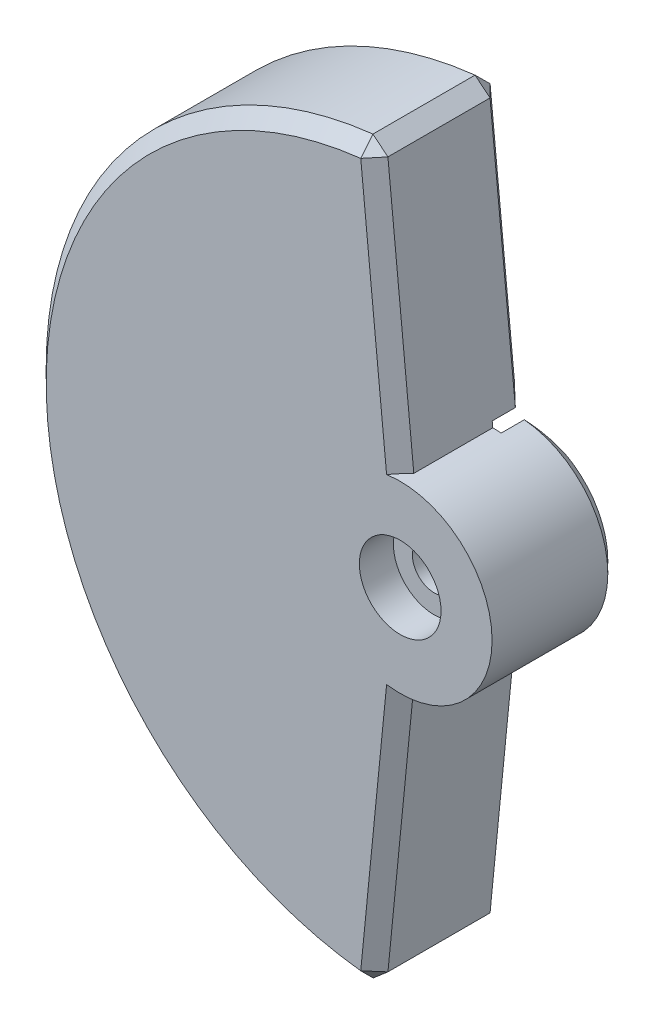
ISO-10303-21;
HEADER;
FILE_DESCRIPTION(('STEP AP214'),'2;1');
FILE_NAME('part.step','',(''),(''),'','','');
FILE_SCHEMA(('AUTOMOTIVE_DESIGN { 1 0 10303 214 1 1 1 1 }'));
ENDSEC;
DATA;
#1=APPLICATION_CONTEXT('core data for automotive mechanical design processes');
#2=APPLICATION_PROTOCOL_DEFINITION('international standard','automotive_design',2000,#1);
#3=PRODUCT_CONTEXT('',#1,'mechanical');
#4=PRODUCT('Part','Part','',(#3));
#5=PRODUCT_RELATED_PRODUCT_CATEGORY('part','',(#4));
#6=PRODUCT_DEFINITION_FORMATION('','',#4);
#7=PRODUCT_DEFINITION_CONTEXT('part definition',#1,'design');
#8=PRODUCT_DEFINITION('design','',#6,#7);
#9=PRODUCT_DEFINITION_SHAPE('','',#8);
#10=(LENGTH_UNIT() NAMED_UNIT(*) SI_UNIT(.MILLI.,.METRE.));
#11=(NAMED_UNIT(*) PLANE_ANGLE_UNIT() SI_UNIT($,.RADIAN.));
#12=(NAMED_UNIT(*) SI_UNIT($,.STERADIAN.) SOLID_ANGLE_UNIT());
#13=UNCERTAINTY_MEASURE_WITH_UNIT(LENGTH_MEASURE(1.E-05),#10,'distance_accuracy_value','');
#14=(GEOMETRIC_REPRESENTATION_CONTEXT(3) GLOBAL_UNCERTAINTY_ASSIGNED_CONTEXT((#13)) GLOBAL_UNIT_ASSIGNED_CONTEXT((#10,
#11,#12)) REPRESENTATION_CONTEXT('',''));
#15=CARTESIAN_POINT('',(0.,0.,0.));
#16=DIRECTION('',(0.,0.,1.));
#17=DIRECTION('',(1.,0.,0.));
#18=AXIS2_PLACEMENT_3D('',#15,#16,#17);
#19=CARTESIAN_POINT('',(0.,0.,10.));
#20=DIRECTION('',(0.,0.,-1.));
#21=DIRECTION('',(-1.,0.,0.));
#22=AXIS2_PLACEMENT_3D('',#19,#20,#21);
#23=CYLINDRICAL_SURFACE('',#22,1.6);
#24=CARTESIAN_POINT('',(0.,0.,2.7));
#25=DIRECTION('',(0.,0.,1.));
#26=DIRECTION('',(1.,0.,0.));
#27=AXIS2_PLACEMENT_3D('',#24,#25,#26);
#28=CIRCLE('',#27,1.6);
#29=CARTESIAN_POINT('',(1.6,0.,2.7));
#30=VERTEX_POINT('',#29);
#31=EDGE_CURVE('E361',#30,#30,#28,.F.);
#32=ORIENTED_EDGE('',*,*,#31,.T.);
#33=EDGE_LOOP('',(#32));
#34=FACE_BOUND('',#33,.T.);
#35=CARTESIAN_POINT('',(0.,0.,7.));
#36=DIRECTION('',(0.,0.,1.));
#37=DIRECTION('',(1.,0.,0.));
#38=AXIS2_PLACEMENT_3D('',#35,#36,#37);
#39=CIRCLE('',#38,1.6);
#40=CARTESIAN_POINT('',(1.6,0.,7.));
#41=VERTEX_POINT('',#40);
#42=EDGE_CURVE('E45',#41,#41,#39,.F.);
#43=ORIENTED_EDGE('',*,*,#42,.F.);
#44=EDGE_LOOP('',(#43));
#45=FACE_BOUND('',#44,.T.);
#46=ADVANCED_FACE('F40',(#34,#45),#23,.F.);
#47=CARTESIAN_POINT('',(0.,0.,0.));
#48=DIRECTION('',(0.,0.,1.));
#49=DIRECTION('',(1.,0.,0.));
#50=AXIS2_PLACEMENT_3D('',#47,#48,#49);
#51=PLANE('',#50);
#52=DIRECTION('',(0.828685457868795,0.559714580761289,0.));
#53=VECTOR('',#52,1.);
#54=CARTESIAN_POINT('',(-10.2278949940436,-14.0459951002762,0.));
#55=LINE('',#54,#53);
#56=CARTESIAN_POINT('',(-10.2278949940436,-14.0459951002762,0.));
#57=VERTEX_POINT('',#56);
#58=CARTESIAN_POINT('',(-1.11821428972066,-7.8930922492929,0.));
#59=VERTEX_POINT('',#58);
#60=EDGE_CURVE('E221',#57,#59,#55,.T.);
#61=ORIENTED_EDGE('',*,*,#60,.T.);
#62=DIRECTION('',(-0.0986450595758293,-0.995122681995181,0.));
#63=VECTOR('',#62,1.);
#64=CARTESIAN_POINT('',(-0.332516112303122,0.0329618370694754,0.));
#65=LINE('',#64,#63);
#66=CARTESIAN_POINT('',(-2.89707584366268,-25.8380910973715,0.));
#67=VERTEX_POINT('',#66);
#68=EDGE_CURVE('E66',#59,#67,#65,.T.);
#69=ORIENTED_EDGE('',*,*,#68,.T.);
#70=CARTESIAN_POINT('',(0.,0.,0.));
#71=DIRECTION('',(0.,0.,1.));
#72=DIRECTION('',(1.,0.,0.));
#73=AXIS2_PLACEMENT_3D('',#70,#71,#72);
#74=CIRCLE('',#73,26.);
#75=CARTESIAN_POINT('',(-2.89707584366267,25.8380910973715,0.));
#76=VERTEX_POINT('',#75);
#77=EDGE_CURVE('E350',#67,#76,#74,.F.);
#78=ORIENTED_EDGE('',*,*,#77,.T.);
#79=DIRECTION('',(0.0986450595758293,-0.995122681995181,0.));
#80=VECTOR('',#79,1.);
#81=CARTESIAN_POINT('',(-0.332516112303121,-0.0329618370694754,0.));
#82=LINE('',#81,#80);
#83=CARTESIAN_POINT('',(-1.11821428972066,7.8930922492929,0.));
#84=VERTEX_POINT('',#83);
#85=EDGE_CURVE('E527',#76,#84,#82,.T.);
#86=ORIENTED_EDGE('',*,*,#85,.T.);
#87=DIRECTION('',(0.828685457868795,-0.559714580761289,0.));
#88=VECTOR('',#87,1.);
#89=CARTESIAN_POINT('',(-10.2278949940436,14.0459951002762,0.));
#90=LINE('',#89,#88);
#91=CARTESIAN_POINT('',(-10.2278949940436,14.0459951002762,0.));
#92=VERTEX_POINT('',#91);
#93=EDGE_CURVE('E253',#92,#84,#90,.T.);
#94=ORIENTED_EDGE('',*,*,#93,.F.);
#95=CARTESIAN_POINT('',(-11.7671100911372,11.767110091137,0.));
#96=DIRECTION('',(0.,0.,1.));
#97=DIRECTION('',(1.,0.,0.));
#98=AXIS2_PLACEMENT_3D('',#95,#96,#97);
#99=CIRCLE('',#98,2.75);
#100=CARTESIAN_POINT('',(-13.9318767752108,10.071148651857,0.));
#101=VERTEX_POINT('',#100);
#102=EDGE_CURVE('E249',#92,#101,#99,.T.);
#103=ORIENTED_EDGE('',*,*,#102,.T.);
#104=DIRECTION('',(0.616713250647291,-0.787187885117684,0.));
#105=VECTOR('',#104,1.);
#106=CARTESIAN_POINT('',(-13.9318767752108,10.071148651857,0.));
#107=LINE('',#106,#105);
#108=CARTESIAN_POINT('',(-6.04175176152328,0.,0.));
#109=VERTEX_POINT('',#108);
#110=EDGE_CURVE('E246',#101,#109,#107,.T.);
#111=ORIENTED_EDGE('',*,*,#110,.T.);
#112=DIRECTION('',(0.616713250647291,0.787187885117684,0.));
#113=VECTOR('',#112,1.);
#114=CARTESIAN_POINT('',(-13.9318767752108,-10.071148651857,0.));
#115=LINE('',#114,#113);
#116=CARTESIAN_POINT('',(-13.9318767752108,-10.071148651857,0.));
#117=VERTEX_POINT('',#116);
#118=EDGE_CURVE('E207',#117,#109,#115,.T.);
#119=ORIENTED_EDGE('',*,*,#118,.F.);
#120=CARTESIAN_POINT('',(-11.7671100911372,-11.767110091137,0.));
#121=DIRECTION('',(0.,0.,-1.));
#122=DIRECTION('',(-1.,0.,0.));
#123=AXIS2_PLACEMENT_3D('',#120,#121,#122);
#124=CIRCLE('',#123,2.75);
#125=EDGE_CURVE('E217',#57,#117,#124,.T.);
#126=ORIENTED_EDGE('',*,*,#125,.F.);
#127=EDGE_LOOP('',(#61,#69,#78,#86,#94,#103,#111,#119,#126));
#128=FACE_BOUND('',#127,.T.);
#129=ADVANCED_FACE('F443',(#128),#51,.F.);
#130=CARTESIAN_POINT('',(0.,0.,-63.6793726413821));
#131=DIRECTION('',(0.,0.,1.));
#132=DIRECTION('',(1.,0.,0.));
#133=AXIS2_PLACEMENT_3D('',#130,#131,#132);
#134=CYLINDRICAL_SURFACE('',#133,6.75);
#135=CARTESIAN_POINT('',(0.,0.,2.69999999999999));
#136=DIRECTION('',(0.,0.,1.));
#137=DIRECTION('',(1.,0.,0.));
#138=AXIS2_PLACEMENT_3D('',#135,#136,#137);
#139=CIRCLE('',#138,6.75);
#140=CARTESIAN_POINT('',(0.615876323061439,-6.72184471366992,2.69999999999999));
#141=VERTEX_POINT('',#140);
#142=CARTESIAN_POINT('',(0.,-6.75,2.7));
#143=VERTEX_POINT('',#142);
#144=EDGE_CURVE('E577',#141,#143,#139,.F.);
#145=ORIENTED_EDGE('',*,*,#144,.F.);
#146=DIRECTION('',(0.,0.,1.));
#147=VECTOR('',#146,1.);
#148=CARTESIAN_POINT('',(0.615876323061434,-6.72184471366993,-63.6793726413821));
#149=LINE('',#148,#147);
#150=CARTESIAN_POINT('',(0.615876323061438,-6.72184471366993,0.999999999999987));
#151=VERTEX_POINT('',#150);
#152=EDGE_CURVE('E289',#141,#151,#149,.F.);
#153=ORIENTED_EDGE('',*,*,#152,.T.);
#154=CARTESIAN_POINT('',(0.,0.,0.999999999999987));
#155=DIRECTION('',(0.,0.,1.));
#156=DIRECTION('',(1.,0.,0.));
#157=AXIS2_PLACEMENT_3D('',#154,#155,#156);
#158=CIRCLE('',#157,6.75);
#159=CARTESIAN_POINT('',(0.615876323061438,6.72184471366993,0.999999999999987));
#160=VERTEX_POINT('',#159);
#161=EDGE_CURVE('E339',#151,#160,#158,.T.);
#162=ORIENTED_EDGE('',*,*,#161,.T.);
#163=DIRECTION('',(0.,0.,1.));
#164=VECTOR('',#163,1.);
#165=CARTESIAN_POINT('',(0.615876323061434,6.72184471366993,-63.6793726413821));
#166=LINE('',#165,#164);
#167=CARTESIAN_POINT('',(0.615876323061439,6.72184471366992,2.69999999999999));
#168=VERTEX_POINT('',#167);
#169=EDGE_CURVE('E585',#168,#160,#166,.F.);
#170=ORIENTED_EDGE('',*,*,#169,.F.);
#171=CARTESIAN_POINT('',(0.,6.75,2.7));
#172=VERTEX_POINT('',#171);
#173=EDGE_CURVE('E572',#172,#168,#139,.F.);
#174=ORIENTED_EDGE('',*,*,#173,.F.);
#175=DIRECTION('',(0.,0.,1.));
#176=VECTOR('',#175,1.);
#177=CARTESIAN_POINT('',(0.,6.75,-0.5));
#178=LINE('',#177,#176);
#179=CARTESIAN_POINT('',(0.,6.75,8.50000000000002));
#180=VERTEX_POINT('',#179);
#181=EDGE_CURVE('E563',#172,#180,#178,.T.);
#182=ORIENTED_EDGE('',*,*,#181,.T.);
#183=CARTESIAN_POINT('',(0.,0.,9.16585415213687));
#184=DIRECTION('',(0.703657996551333,0.0697525905566195,0.707106781186551));
#185=DIRECTION('',(-0.70365799655134,-0.0697525905566202,0.707106781186544));
#186=AXIS2_PLACEMENT_3D('',#183,#184,#185);
#187=ELLIPSE('',#186,9.54594154601835,6.75);
#188=CARTESIAN_POINT('',(-0.99755390763124,6.67588093073638,9.5));
#189=VERTEX_POINT('',#188);
#190=EDGE_CURVE('E348',#180,#189,#187,.T.);
#191=ORIENTED_EDGE('',*,*,#190,.T.);
#192=CARTESIAN_POINT('',(0.,0.,9.5));
#193=DIRECTION('',(0.,0.,1.));
#194=DIRECTION('',(1.,0.,0.));
#195=AXIS2_PLACEMENT_3D('',#192,#193,#194);
#196=CIRCLE('',#195,6.75);
#197=CARTESIAN_POINT('',(-0.99755390763124,-6.67588093073638,9.5));
#198=VERTEX_POINT('',#197);
#199=EDGE_CURVE('E560',#198,#189,#196,.T.);
#200=ORIENTED_EDGE('',*,*,#199,.F.);
#201=CARTESIAN_POINT('',(0.,0.,9.16585415213687));
#202=DIRECTION('',(0.703657996551333,-0.0697525905566195,0.707106781186551));
#203=DIRECTION('',(-0.70365799655134,0.0697525905566202,0.707106781186544));
#204=AXIS2_PLACEMENT_3D('',#201,#202,#203);
#205=ELLIPSE('',#204,9.54594154601835,6.75);
#206=CARTESIAN_POINT('',(0.,-6.75,8.50000000000002));
#207=VERTEX_POINT('',#206);
#208=EDGE_CURVE('E343',#198,#207,#205,.T.);
#209=ORIENTED_EDGE('',*,*,#208,.T.);
#210=DIRECTION('',(0.,0.,1.));
#211=VECTOR('',#210,1.);
#212=CARTESIAN_POINT('',(0.,-6.75,-0.5));
#213=LINE('',#212,#211);
#214=EDGE_CURVE('E564',#143,#207,#213,.T.);
#215=ORIENTED_EDGE('',*,*,#214,.F.);
#216=EDGE_LOOP('',(#145,#153,#162,#170,#174,#182,#191,#200,#209,#215));
#217=FACE_BOUND('',#216,.T.);
#218=ADVANCED_FACE('F450',(#217),#134,.T.);
#219=CARTESIAN_POINT('',(-2.,-26.9258240356725,10.));
#220=DIRECTION('',(-0.995122681995181,0.0986450595758292,0.));
#221=DIRECTION('',(-0.0986450595758292,-0.995122681995181,0.));
#222=AXIS2_PLACEMENT_3D('',#219,#220,#221);
#223=PLANE('',#222);
#224=DIRECTION('',(0.,0.,-1.));
#225=VECTOR('',#224,1.);
#226=CARTESIAN_POINT('',(-0.0412030045650611,-7.16565228492286,10.));
#227=LINE('',#226,#225);
#228=CARTESIAN_POINT('',(-0.0412030045650624,-7.16565228492286,2.7));
#229=VERTEX_POINT('',#228);
#230=CARTESIAN_POINT('',(-0.0412030045650615,-7.16565228492286,0.99999999999998));
#231=VERTEX_POINT('',#230);
#232=EDGE_CURVE('E58',#229,#231,#227,.T.);
#233=ORIENTED_EDGE('',*,*,#232,.F.);
#234=DIRECTION('',(0.0986450595758292,0.995122681995181,0.));
#235=VECTOR('',#234,1.);
#236=CARTESIAN_POINT('',(-2.,-26.9258240356725,2.7));
#237=LINE('',#236,#235);
#238=EDGE_CURVE('E11',#229,#143,#237,.T.);
#239=ORIENTED_EDGE('',*,*,#238,.T.);
#240=ORIENTED_EDGE('',*,*,#214,.T.);
#241=DIRECTION('',(-0.0986450595758292,-0.995122681995181,0.));
#242=VECTOR('',#241,1.);
#243=CARTESIAN_POINT('',(-2.,-26.9258240356725,8.50000000000002));
#244=LINE('',#243,#242);
#245=CARTESIAN_POINT('',(-1.8988291701755,-25.9052216056314,8.50000000000002));
#246=VERTEX_POINT('',#245);
#247=EDGE_CURVE('E550',#207,#246,#244,.T.);
#248=ORIENTED_EDGE('',*,*,#247,.T.);
#249=DIRECTION('',(0.,0.,-1.));
#250=VECTOR('',#249,1.);
#251=CARTESIAN_POINT('',(-1.8988291701755,-25.9052216056314,10.));
#252=LINE('',#251,#250);
#253=CARTESIAN_POINT('',(-1.8988291701755,-25.9052216056314,0.99999999999998));
#254=VERTEX_POINT('',#253);
#255=EDGE_CURVE('E481',#246,#254,#252,.T.);
#256=ORIENTED_EDGE('',*,*,#255,.T.);
#257=DIRECTION('',(0.0986450595758292,0.995122681995181,0.));
#258=VECTOR('',#257,1.);
#259=CARTESIAN_POINT('',(-2.,-26.9258240356725,0.99999999999998));
#260=LINE('',#259,#258);
#261=EDGE_CURVE('E556',#254,#231,#260,.T.);
#262=ORIENTED_EDGE('',*,*,#261,.T.);
#263=EDGE_LOOP('',(#233,#239,#240,#248,#256,#262));
#264=FACE_BOUND('',#263,.T.);
#265=ADVANCED_FACE('F441',(#264),#223,.F.);
#266=CARTESIAN_POINT('',(0.,0.,0.));
#267=DIRECTION('',(0.,0.,1.));
#268=DIRECTION('',(1.,0.,0.));
#269=AXIS2_PLACEMENT_3D('',#266,#267,#268);
#270=CONICAL_SURFACE('',#269,5.75000000000001,0.78539816339745);
#271=ORIENTED_EDGE('',*,*,#161,.F.);
#272=CARTESIAN_POINT('',(0.615532322796266,-6.72207705992673,1.0002));
#273=CARTESIAN_POINT('',(0.709532921431451,-6.65858673901327,0.945553273751343));
#274=CARTESIAN_POINT('',(0.804240692140544,-6.59461877665322,0.892675597750408));
#275=CARTESIAN_POINT('',(0.995194104990957,-6.46564413566775,0.790967028685389));
#276=CARTESIAN_POINT('',(1.09144053602868,-6.40063692420226,0.742138296491091));
#277=CARTESIAN_POINT('',(1.3835321600231,-6.20335104291218,0.602089897899118));
#278=CARTESIAN_POINT('',(1.58175272484611,-6.06946798838929,0.517888349826741));
#279=CARTESIAN_POINT('',(1.97882183748551,-5.80127772415346,0.375345490649337));
#280=CARTESIAN_POINT('',(2.17750886515518,-5.6670796091282,0.316367219826499));
#281=CARTESIAN_POINT('',(2.47843205767656,-5.46382866880566,0.248490826942447));
#282=CARTESIAN_POINT('',(2.57911031451245,-5.39582809297608,0.229306959232994));
#283=CARTESIAN_POINT('',(2.78122334686556,-5.25931596995554,0.198193698773494));
#284=CARTESIAN_POINT('',(2.88265789055294,-5.19080457934817,0.18626216855224));
#285=CARTESIAN_POINT('',(3.03855275852782,-5.08550934357101,0.173759919971848));
#286=CARTESIAN_POINT('',(3.09287288999928,-5.04882018808416,0.170486051235866));
#287=CARTESIAN_POINT('',(3.20176629146947,-4.97527090111065,0.166104864524918));
#288=CARTESIAN_POINT('',(3.25633977508401,-4.93841062534263,0.165005286596231));
#289=CARTESIAN_POINT('',(3.31091729882186,-4.90154762077575,0.165009927157367));
#290=B_SPLINE_CURVE_WITH_KNOTS('',3,(#272,#273,#274,#275,#276,#277,#278,#279,#280,#281,#282,
#283,#284,#285,#286,#287,#288,#289),.UNSPECIFIED.,.F.,.F.,(4,2,2,2,2,2,2,2,4),(0.,
0.377707379498539,0.755615056358309,1.51536244338989,2.25459250703446,2.62340243309934,
2.9921036075611,3.1889663227311,3.38652857767701),.UNSPECIFIED.);
#291=CARTESIAN_POINT('',(3.31071729882186,-4.90168270570465,0.165009922233629));
#292=VERTEX_POINT('',#291);
#293=EDGE_CURVE('E279',#151,#292,#290,.T.);
#294=ORIENTED_EDGE('',*,*,#293,.T.);
#295=CARTESIAN_POINT('',(0.,0.,0.165009922233628));
#296=DIRECTION('',(0.,0.,1.));
#297=DIRECTION('',(1.,0.,0.));
#298=AXIS2_PLACEMENT_3D('',#295,#296,#297);
#299=CIRCLE('',#298,5.91500992223364);
#300=CARTESIAN_POINT('',(3.31071729882187,4.90168270570465,0.165009922233629));
#301=VERTEX_POINT('',#300);
#302=EDGE_CURVE('E51',#301,#292,#299,.F.);
#303=ORIENTED_EDGE('',*,*,#302,.F.);
#304=CARTESIAN_POINT('',(0.615532322796267,6.72207705992673,1.0002));
#305=CARTESIAN_POINT('',(0.709532921431452,6.65858673901327,0.945553273751343));
#306=CARTESIAN_POINT('',(0.804240692140545,6.59461877665322,0.892675597750407));
#307=CARTESIAN_POINT('',(0.995194104990958,6.46564413566775,0.790967028685388));
#308=CARTESIAN_POINT('',(1.09144053602868,6.40063692420226,0.742138296491091));
#309=CARTESIAN_POINT('',(1.3835321600231,6.20335104291218,0.602089897899117));
#310=CARTESIAN_POINT('',(1.58175272484611,6.06946798838929,0.517888349826741));
#311=CARTESIAN_POINT('',(1.97882183748551,5.80127772415346,0.375345490649337));
#312=CARTESIAN_POINT('',(2.17750886515518,5.6670796091282,0.3163672198265));
#313=CARTESIAN_POINT('',(2.47843205767656,5.46382866880566,0.248490826942446));
#314=CARTESIAN_POINT('',(2.57911031451244,5.39582809297608,0.229306959232993));
#315=CARTESIAN_POINT('',(2.78122334686556,5.25931596995554,0.198193698773493));
#316=CARTESIAN_POINT('',(2.88265789055294,5.19080457934817,0.186262168552241));
#317=CARTESIAN_POINT('',(3.03855275852782,5.08550934357101,0.173759919971849));
#318=CARTESIAN_POINT('',(3.09287288999928,5.04882018808416,0.170486051235866));
#319=CARTESIAN_POINT('',(3.20176629146947,4.97527090111065,0.166104864524917));
#320=CARTESIAN_POINT('',(3.25633977508401,4.93841062534263,0.165005286596231));
#321=CARTESIAN_POINT('',(3.31091729882187,4.90154762077575,0.165009927157366));
#322=B_SPLINE_CURVE_WITH_KNOTS('',3,(#304,#305,#306,#307,#308,#309,#310,#311,#312,#313,#314,
#315,#316,#317,#318,#319,#320,#321),.UNSPECIFIED.,.F.,.F.,(4,2,2,2,2,2,2,2,4),(0.,
0.377707379498539,0.755615056358309,1.51536244338988,2.25459250703445,2.62340243309933,
2.9921036075611,3.1889663227311,3.38652857767701),.UNSPECIFIED.);
#323=EDGE_CURVE('E318',#160,#301,#322,.T.);
#324=ORIENTED_EDGE('',*,*,#323,.F.);
#325=EDGE_LOOP('',(#271,#294,#303,#324));
#326=FACE_BOUND('',#325,.T.);
#327=ADVANCED_FACE('F292',(#326),#270,.T.);
#328=CARTESIAN_POINT('',(-2.,-26.9258240356725,0.99999999999998));
#329=DIRECTION('',(-0.703657996551333,0.0697525905566195,0.707106781186551));
#330=DIRECTION('',(0.0986450595758292,0.995122681995181,0.));
#331=AXIS2_PLACEMENT_3D('',#328,#329,#330);
#332=PLANE('',#331);
#333=ORIENTED_EDGE('',*,*,#68,.F.);
#334=DIRECTION('',(-0.65677253653374,-0.44360035698818,-0.609810264373269));
#335=VECTOR('',#334,1.);
#336=CARTESIAN_POINT('',(-6.64314839561764,-11.6247689035072,-5.1298757794341));
#337=LINE('',#336,#335);
#338=EDGE_CURVE('E326',#59,#231,#337,.F.);
#339=ORIENTED_EDGE('',*,*,#338,.T.);
#340=ORIENTED_EDGE('',*,*,#261,.F.);
#341=DIRECTION('',(-0.705690075517857,0.0474565402537722,-0.706929553847301));
#342=VECTOR('',#341,1.);
#343=CARTESIAN_POINT('',(-1.8988291701755,-25.9052216056314,0.99999999999998));
#344=LINE('',#343,#342);
#345=EDGE_CURVE('E373',#67,#254,#344,.F.);
#346=ORIENTED_EDGE('',*,*,#345,.F.);
#347=EDGE_LOOP('',(#333,#339,#340,#346));
#348=FACE_BOUND('',#347,.T.);
#349=ADVANCED_FACE('F427',(#348),#332,.F.);
#350=CARTESIAN_POINT('',(0.,0.,9.5));
#351=DIRECTION('',(0.,0.,1.));
#352=DIRECTION('',(1.,0.,0.));
#353=AXIS2_PLACEMENT_3D('',#350,#351,#352);
#354=PLANE('',#353);
#355=CARTESIAN_POINT('',(0.,0.,9.5));
#356=DIRECTION('',(0.,0.,1.));
#357=DIRECTION('',(1.,0.,0.));
#358=AXIS2_PLACEMENT_3D('',#355,#356,#357);
#359=CIRCLE('',#358,3.);
#360=CARTESIAN_POINT('',(3.,0.,9.5));
#361=VERTEX_POINT('',#360);
#362=EDGE_CURVE('E224',#361,#361,#359,.T.);
#363=ORIENTED_EDGE('',*,*,#362,.F.);
#364=EDGE_LOOP('',(#363));
#365=FACE_BOUND('',#364,.T.);
#366=DIRECTION('',(0.0986450595758293,0.995122681995181,0.));
#367=VECTOR('',#366,1.);
#368=CARTESIAN_POINT('',(-0.995122681995167,-6.65135494042417,9.5));
#369=LINE('',#368,#367);
#370=CARTESIAN_POINT('',(-2.89707584366267,-25.8380910973715,9.5));
#371=VERTEX_POINT('',#370);
#372=EDGE_CURVE('E523',#371,#198,#369,.T.);
#373=ORIENTED_EDGE('',*,*,#372,.T.);
#374=ORIENTED_EDGE('',*,*,#199,.T.);
#375=DIRECTION('',(-0.0986450595758293,0.995122681995181,0.));
#376=VECTOR('',#375,1.);
#377=CARTESIAN_POINT('',(-2.99512268199517,26.8271789760967,9.5));
#378=LINE('',#377,#376);
#379=CARTESIAN_POINT('',(-2.89707584366267,25.8380910973715,9.5));
#380=VERTEX_POINT('',#379);
#381=EDGE_CURVE('E517',#189,#380,#378,.T.);
#382=ORIENTED_EDGE('',*,*,#381,.T.);
#383=CARTESIAN_POINT('',(0.,0.,9.5));
#384=DIRECTION('',(0.,0.,1.));
#385=DIRECTION('',(1.,0.,0.));
#386=AXIS2_PLACEMENT_3D('',#383,#384,#385);
#387=CIRCLE('',#386,26.);
#388=EDGE_CURVE('E520',#380,#371,#387,.T.);
#389=ORIENTED_EDGE('',*,*,#388,.T.);
#390=EDGE_LOOP('',(#373,#374,#382,#389));
#391=FACE_BOUND('',#390,.T.);
#392=ADVANCED_FACE('F431',(#365,#391),#354,.T.);
#393=CARTESIAN_POINT('',(0.,0.,9.5));
#394=DIRECTION('',(0.,0.,-1.));
#395=DIRECTION('',(-1.,0.,0.));
#396=AXIS2_PLACEMENT_3D('',#393,#394,#395);
#397=CYLINDRICAL_SURFACE('',#396,27.);
#398=DIRECTION('',(0.,0.,-1.));
#399=VECTOR('',#398,1.);
#400=CARTESIAN_POINT('',(-2.97810968968416,-26.8352541012044,9.5));
#401=LINE('',#400,#399);
#402=CARTESIAN_POINT('',(-2.97810968968416,-26.8352541012044,0.99999999999998));
#403=VERTEX_POINT('',#402);
#404=CARTESIAN_POINT('',(-2.97810968968416,-26.8352541012044,8.50000000000002));
#405=VERTEX_POINT('',#404);
#406=EDGE_CURVE('E478',#403,#405,#401,.F.);
#407=ORIENTED_EDGE('',*,*,#406,.T.);
#408=CARTESIAN_POINT('',(0.,0.,8.50000000000002));
#409=DIRECTION('',(0.,0.,1.));
#410=DIRECTION('',(1.,0.,0.));
#411=AXIS2_PLACEMENT_3D('',#408,#409,#410);
#412=CIRCLE('',#411,27.);
#413=CARTESIAN_POINT('',(-3.00175980719534,26.8326189191422,8.50000000000002));
#414=VERTEX_POINT('',#413);
#415=EDGE_CURVE('E492',#405,#414,#412,.F.);
#416=ORIENTED_EDGE('',*,*,#415,.T.);
#417=DIRECTION('',(0.,0.,-1.));
#418=VECTOR('',#417,1.);
#419=CARTESIAN_POINT('',(-3.00175980719534,26.8326189191422,9.5));
#420=LINE('',#419,#418);
#421=CARTESIAN_POINT('',(-3.00175980719534,26.8326189191422,0.99999999999998));
#422=VERTEX_POINT('',#421);
#423=EDGE_CURVE('E502',#414,#422,#420,.T.);
#424=ORIENTED_EDGE('',*,*,#423,.T.);
#425=CARTESIAN_POINT('',(0.,0.,0.99999999999998));
#426=DIRECTION('',(0.,0.,1.));
#427=DIRECTION('',(1.,0.,0.));
#428=AXIS2_PLACEMENT_3D('',#425,#426,#427);
#429=CIRCLE('',#428,27.);
#430=EDGE_CURVE('E499',#422,#403,#429,.T.);
#431=ORIENTED_EDGE('',*,*,#430,.T.);
#432=EDGE_LOOP('',(#407,#416,#424,#431));
#433=FACE_BOUND('',#432,.T.);
#434=ADVANCED_FACE('F438',(#433),#397,.T.);
#435=CARTESIAN_POINT('',(-2.,26.9258240356725,10.));
#436=DIRECTION('',(-0.995122681995181,-0.0986450595758292,0.));
#437=DIRECTION('',(0.0986450595758292,-0.995122681995181,0.));
#438=AXIS2_PLACEMENT_3D('',#435,#436,#437);
#439=PLANE('',#438);
#440=DIRECTION('',(-0.0986450595758292,0.995122681995181,0.));
#441=VECTOR('',#440,1.);
#442=CARTESIAN_POINT('',(-2.,26.9258240356725,2.7));
#443=LINE('',#442,#441);
#444=CARTESIAN_POINT('',(-0.0412030045650624,7.16565228492286,2.7));
#445=VERTEX_POINT('',#444);
#446=EDGE_CURVE('E573',#172,#445,#443,.T.);
#447=ORIENTED_EDGE('',*,*,#446,.T.);
#448=DIRECTION('',(0.,0.,-1.));
#449=VECTOR('',#448,1.);
#450=CARTESIAN_POINT('',(-0.0412030045650611,7.16565228492286,10.));
#451=LINE('',#450,#449);
#452=CARTESIAN_POINT('',(-0.0412030045650602,7.16565228492286,0.999999999999981));
#453=VERTEX_POINT('',#452);
#454=EDGE_CURVE('E580',#445,#453,#451,.T.);
#455=ORIENTED_EDGE('',*,*,#454,.T.);
#456=DIRECTION('',(-0.0986450595758292,0.995122681995181,0.));
#457=VECTOR('',#456,1.);
#458=CARTESIAN_POINT('',(-2.,26.9258240356725,0.99999999999998));
#459=LINE('',#458,#457);
#460=CARTESIAN_POINT('',(-1.90135494042417,25.9307013536773,0.99999999999998));
#461=VERTEX_POINT('',#460);
#462=EDGE_CURVE('E496',#453,#461,#459,.T.);
#463=ORIENTED_EDGE('',*,*,#462,.T.);
#464=DIRECTION('',(0.,0.,1.));
#465=VECTOR('',#464,1.);
#466=CARTESIAN_POINT('',(-1.90135494042417,25.9307013536773,10.));
#467=LINE('',#466,#465);
#468=CARTESIAN_POINT('',(-1.90135494042417,25.9307013536773,8.50000000000002));
#469=VERTEX_POINT('',#468);
#470=EDGE_CURVE('E510',#461,#469,#467,.T.);
#471=ORIENTED_EDGE('',*,*,#470,.T.);
#472=DIRECTION('',(0.0986450595758292,-0.995122681995181,0.));
#473=VECTOR('',#472,1.);
#474=CARTESIAN_POINT('',(0.,6.75,8.50000000000002));
#475=LINE('',#474,#473);
#476=EDGE_CURVE('E513',#469,#180,#475,.T.);
#477=ORIENTED_EDGE('',*,*,#476,.T.);
#478=ORIENTED_EDGE('',*,*,#181,.F.);
#479=EDGE_LOOP('',(#447,#455,#463,#471,#477,#478));
#480=FACE_BOUND('',#479,.T.);
#481=ADVANCED_FACE('F460',(#480),#439,.F.);
#482=CARTESIAN_POINT('',(-2.,26.9258240356725,8.50000000000002));
#483=DIRECTION('',(0.703657996551333,0.0697525905566195,0.707106781186551));
#484=DIRECTION('',(-0.0986450595758292,0.995122681995181,0.));
#485=AXIS2_PLACEMENT_3D('',#482,#483,#484);
#486=PLANE('',#485);
#487=ORIENTED_EDGE('',*,*,#190,.F.);
#488=ORIENTED_EDGE('',*,*,#476,.F.);
#489=DIRECTION('',(0.704074529491099,0.0654847381656188,-0.707100280009326));
#490=VECTOR('',#489,1.);
#491=CARTESIAN_POINT('',(-1.90135494042417,25.9307013536773,8.50000000000002));
#492=LINE('',#491,#490);
#493=EDGE_CURVE('E547',#380,#469,#492,.T.);
#494=ORIENTED_EDGE('',*,*,#493,.F.);
#495=ORIENTED_EDGE('',*,*,#381,.F.);
#496=EDGE_LOOP('',(#487,#488,#494,#495));
#497=FACE_BOUND('',#496,.T.);
#498=ADVANCED_FACE('F43',(#497),#486,.T.);
#499=CARTESIAN_POINT('',(-2.,26.9258240356725,0.99999999999998));
#500=DIRECTION('',(-0.703657996551333,-0.0697525905566195,0.707106781186551));
#501=DIRECTION('',(-0.0986450595758292,0.995122681995181,0.));
#502=AXIS2_PLACEMENT_3D('',#499,#500,#501);
#503=PLANE('',#502);
#504=DIRECTION('',(-0.65677253653374,0.44360035698818,-0.609810264373269));
#505=VECTOR('',#504,1.);
#506=CARTESIAN_POINT('',(-6.64314839561764,11.6247689035072,-5.1298757794341));
#507=LINE('',#506,#505);
#508=EDGE_CURVE('E542',#84,#453,#507,.F.);
#509=ORIENTED_EDGE('',*,*,#508,.F.);
#510=ORIENTED_EDGE('',*,*,#85,.F.);
#511=DIRECTION('',(0.704074529491099,0.0654847381656187,0.707100280009326));
#512=VECTOR('',#511,1.);
#513=CARTESIAN_POINT('',(-2.40526474462168,25.883833585842,0.493924650412995));
#514=LINE('',#513,#512);
#515=EDGE_CURVE('E540',#461,#76,#514,.F.);
#516=ORIENTED_EDGE('',*,*,#515,.F.);
#517=ORIENTED_EDGE('',*,*,#462,.F.);
#518=EDGE_LOOP('',(#509,#510,#516,#517));
#519=FACE_BOUND('',#518,.T.);
#520=ADVANCED_FACE('F538',(#519),#503,.F.);
#521=CARTESIAN_POINT('',(-3.00175980719534,26.8326189191422,9.5));
#522=DIRECTION('',(-0.633905405994716,-0.773410587107957,0.));
#523=DIRECTION('',(0.,0.,-1.));
#524=AXIS2_PLACEMENT_3D('',#521,#522,#523);
#525=PLANE('',#524);
#526=DIRECTION('',(0.773410587107956,-0.633905405994716,0.));
#527=VECTOR('',#526,1.);
#528=CARTESIAN_POINT('',(-1.90135494042417,25.9307013536773,8.50000000000002));
#529=LINE('',#528,#527);
#530=EDGE_CURVE('E567',#469,#414,#529,.F.);
#531=ORIENTED_EDGE('',*,*,#530,.F.);
#532=ORIENTED_EDGE('',*,*,#470,.F.);
#533=DIRECTION('',(-0.773410587107957,0.633905405994716,0.));
#534=VECTOR('',#533,1.);
#535=CARTESIAN_POINT('',(-3.00175980719534,26.8326189191422,0.99999999999998));
#536=LINE('',#535,#534);
#537=EDGE_CURVE('E545',#422,#461,#536,.F.);
#538=ORIENTED_EDGE('',*,*,#537,.F.);
#539=ORIENTED_EDGE('',*,*,#423,.F.);
#540=EDGE_LOOP('',(#531,#532,#538,#539));
#541=FACE_BOUND('',#540,.T.);
#542=ADVANCED_FACE('F618',(#541),#525,.F.);
#543=CARTESIAN_POINT('',(-1.90135494042417,25.9307013536773,8.50000000000002));
#544=DIRECTION('',(0.518627858744102,0.632763615720233,0.575009000586221));
#545=DIRECTION('',(0.,-0.672525080584366,0.740074331391781));
#546=AXIS2_PLACEMENT_3D('',#543,#544,#545);
#547=PLANE('',#546);
#548=ORIENTED_EDGE('',*,*,#493,.T.);
#549=ORIENTED_EDGE('',*,*,#530,.T.);
#550=CARTESIAN_POINT('',(-3.00175980719534,26.8326189191422,8.50000000000002));
#551=CARTESIAN_POINT('',(-2.98431262323041,26.6668643367112,8.66666673589928));
#552=CARTESIAN_POINT('',(-2.96686536762023,26.5011097270148,8.83333343718223));
#553=CARTESIAN_POINT('',(-2.93197071310935,26.1696004530912,9.16666677051556));
#554=CARTESIAN_POINT('',(-2.91452331420865,26.003845788864,9.33333340256593));
#555=CARTESIAN_POINT('',(-2.89707584366269,25.8380910973715,9.50000000000001));
#556=B_SPLINE_CURVE_WITH_KNOTS('',3,(#550,#551,#552,#553,#554,#555),.UNSPECIFIED.,.F.,.F.,(4,2,
4),(0.,0.707114615974153,1.41422923194831),.UNSPECIFIED.);
#557=EDGE_CURVE('E404',#380,#414,#556,.F.);
#558=ORIENTED_EDGE('',*,*,#557,.F.);
#559=EDGE_LOOP('',(#548,#549,#558));
#560=FACE_BOUND('',#559,.T.);
#561=ADVANCED_FACE('F424',(#560),#547,.T.);
#562=CARTESIAN_POINT('',(-3.00175980719534,26.8326189191422,0.99999999999998));
#563=DIRECTION('',(0.518627858744102,0.632763615720233,-0.575009000586222));
#564=DIRECTION('',(0.,0.672525080584366,0.740074331391781));
#565=AXIS2_PLACEMENT_3D('',#562,#563,#564);
#566=PLANE('',#565);
#567=ORIENTED_EDGE('',*,*,#537,.T.);
#568=ORIENTED_EDGE('',*,*,#515,.T.);
#569=CARTESIAN_POINT('',(-2.89707584366267,25.8380910973715,0.));
#570=CARTESIAN_POINT('',(-2.91452331420864,26.003845788864,0.16666659743407));
#571=CARTESIAN_POINT('',(-2.93197071310934,26.1696004530912,0.333333229484437));
#572=CARTESIAN_POINT('',(-2.96686536762024,26.5011097270148,0.666666562817761));
#573=CARTESIAN_POINT('',(-2.98431262323042,26.6668643367112,0.833333264100719));
#574=CARTESIAN_POINT('',(-3.00175980719535,26.8326189191422,0.999999999999973));
#575=B_SPLINE_CURVE_WITH_KNOTS('',3,(#569,#570,#571,#572,#573,#574),.UNSPECIFIED.,.F.,.F.,(4,2,
4),(0.,0.707114615974158,1.41422923194831),.UNSPECIFIED.);
#576=EDGE_CURVE('E394',#422,#76,#575,.F.);
#577=ORIENTED_EDGE('',*,*,#576,.F.);
#578=EDGE_LOOP('',(#567,#568,#577));
#579=FACE_BOUND('',#578,.T.);
#580=ADVANCED_FACE('F417',(#579),#566,.T.);
#581=CARTESIAN_POINT('',(0.,0.,9.5));
#582=DIRECTION('',(0.,0.,-1.));
#583=DIRECTION('',(-1.,0.,0.));
#584=AXIS2_PLACEMENT_3D('',#581,#582,#583);
#585=CONICAL_SURFACE('',#584,26.,0.785398163397454);
#586=ORIENTED_EDGE('',*,*,#557,.T.);
#587=ORIENTED_EDGE('',*,*,#415,.F.);
#588=CARTESIAN_POINT('',(-2.89707584366267,-25.8380910973715,9.5));
#589=CARTESIAN_POINT('',(-2.91058430092629,-26.0042860822661,9.33333470920276));
#590=CARTESIAN_POINT('',(-2.9240913500599,-26.1704804916996,9.16666873047073));
#591=CARTESIAN_POINT('',(-2.95110263206706,-26.502868159644,8.8333353971374));
#592=CARTESIAN_POINT('',(-2.96460686494061,-26.6690614181548,8.66666804253611));
#593=CARTESIAN_POINT('',(-2.97810968968416,-26.8352541012044,8.50000000000002));
#594=B_SPLINE_CURVE_WITH_KNOTS('',3,(#588,#589,#590,#591,#592,#593),.UNSPECIFIED.,.F.,.F.,(4,2,
4),(0.,0.707265957847244,1.41453191569315),.UNSPECIFIED.);
#595=EDGE_CURVE('E405',#371,#405,#594,.T.);
#596=ORIENTED_EDGE('',*,*,#595,.F.);
#597=ORIENTED_EDGE('',*,*,#388,.F.);
#598=EDGE_LOOP('',(#586,#587,#596,#597));
#599=FACE_BOUND('',#598,.T.);
#600=ADVANCED_FACE('F423',(#599),#585,.T.);
#601=CARTESIAN_POINT('',(-2.,-26.9258240356725,8.50000000000002));
#602=DIRECTION('',(0.703657996551333,-0.0697525905566195,0.707106781186551));
#603=DIRECTION('',(0.0986450595758292,0.995122681995181,0.));
#604=AXIS2_PLACEMENT_3D('',#601,#602,#603);
#605=PLANE('',#604);
#606=ORIENTED_EDGE('',*,*,#208,.F.);
#607=ORIENTED_EDGE('',*,*,#372,.F.);
#608=DIRECTION('',(-0.705690075517857,0.0474565402537721,0.706929553847301));
#609=VECTOR('',#608,1.);
#610=CARTESIAN_POINT('',(-2.40516280620537,-25.8711714702906,9.0072229634997));
#611=LINE('',#610,#609);
#612=EDGE_CURVE('E487',#246,#371,#611,.T.);
#613=ORIENTED_EDGE('',*,*,#612,.F.);
#614=ORIENTED_EDGE('',*,*,#247,.F.);
#615=EDGE_LOOP('',(#606,#607,#613,#614));
#616=FACE_BOUND('',#615,.T.);
#617=ADVANCED_FACE('F388',(#616),#605,.T.);
#618=CARTESIAN_POINT('',(0.,0.,0.99999999999998));
#619=DIRECTION('',(0.,0.,1.));
#620=DIRECTION('',(1.,0.,0.));
#621=AXIS2_PLACEMENT_3D('',#618,#619,#620);
#622=CONICAL_SURFACE('',#621,27.,0.785398163397454);
#623=ORIENTED_EDGE('',*,*,#576,.T.);
#624=ORIENTED_EDGE('',*,*,#77,.F.);
#625=CARTESIAN_POINT('',(-2.97810968968416,-26.8352541012044,0.99999999999998));
#626=CARTESIAN_POINT('',(-2.96460686494061,-26.6690614181548,0.833331957463894));
#627=CARTESIAN_POINT('',(-2.95110263206706,-26.502868159644,0.666664602862598));
#628=CARTESIAN_POINT('',(-2.9240913500599,-26.1704804916996,0.333331269529272));
#629=CARTESIAN_POINT('',(-2.91058430092629,-26.0042860822661,0.166665290797241));
#630=CARTESIAN_POINT('',(-2.89707584366268,-25.8380910973715,0.));
#631=B_SPLINE_CURVE_WITH_KNOTS('',3,(#625,#626,#627,#628,#629,#630),.UNSPECIFIED.,.F.,.F.,(4,2,
4),(0.,0.707265957845901,1.41453191569315),.UNSPECIFIED.);
#632=EDGE_CURVE('E364',#403,#67,#631,.T.);
#633=ORIENTED_EDGE('',*,*,#632,.F.);
#634=ORIENTED_EDGE('',*,*,#430,.F.);
#635=EDGE_LOOP('',(#623,#624,#633,#634));
#636=FACE_BOUND('',#635,.T.);
#637=ADVANCED_FACE('F380',(#636),#622,.T.);
#638=CARTESIAN_POINT('',(-2.97810968968416,-26.8352541012044,8.50000000000002));
#639=DIRECTION('',(0.534156045043758,-0.619875344719367,0.574832042036852));
#640=DIRECTION('',(0.,-0.679964075800062,-0.733245426594239));
#641=AXIS2_PLACEMENT_3D('',#638,#639,#640);
#642=PLANE('',#641);
#643=ORIENTED_EDGE('',*,*,#612,.T.);
#644=ORIENTED_EDGE('',*,*,#595,.T.);
#645=DIRECTION('',(-0.757542456556779,-0.652785896380982,0.));
#646=VECTOR('',#645,1.);
#647=CARTESIAN_POINT('',(-2.97810968968416,-26.8352541012044,8.50000000000002));
#648=LINE('',#647,#646);
#649=EDGE_CURVE('E360',#246,#405,#648,.T.);
#650=ORIENTED_EDGE('',*,*,#649,.F.);
#651=EDGE_LOOP('',(#643,#644,#650));
#652=FACE_BOUND('',#651,.T.);
#653=ADVANCED_FACE('F387',(#652),#642,.T.);
#654=CARTESIAN_POINT('',(-1.8988291701755,-25.9052216056314,0.99999999999998));
#655=DIRECTION('',(0.534156045043758,-0.619875344719366,-0.574832042036852));
#656=DIRECTION('',(0.,0.679964075800063,-0.733245426594239));
#657=AXIS2_PLACEMENT_3D('',#654,#655,#656);
#658=PLANE('',#657);
#659=ORIENTED_EDGE('',*,*,#632,.T.);
#660=ORIENTED_EDGE('',*,*,#345,.T.);
#661=DIRECTION('',(0.757542456556778,0.652785896380982,0.));
#662=VECTOR('',#661,1.);
#663=CARTESIAN_POINT('',(-1.8988291701755,-25.9052216056314,0.99999999999998));
#664=LINE('',#663,#662);
#665=EDGE_CURVE('E357',#403,#254,#664,.T.);
#666=ORIENTED_EDGE('',*,*,#665,.F.);
#667=EDGE_LOOP('',(#659,#660,#666));
#668=FACE_BOUND('',#667,.T.);
#669=ADVANCED_FACE('F376',(#668),#658,.T.);
#670=CARTESIAN_POINT('',(-1.8988291701755,-25.9052216056314,9.5));
#671=DIRECTION('',(-0.652785896380982,0.757542456556778,0.));
#672=DIRECTION('',(0.,0.,-1.));
#673=AXIS2_PLACEMENT_3D('',#670,#671,#672);
#674=PLANE('',#673);
#675=ORIENTED_EDGE('',*,*,#649,.T.);
#676=ORIENTED_EDGE('',*,*,#406,.F.);
#677=ORIENTED_EDGE('',*,*,#665,.T.);
#678=ORIENTED_EDGE('',*,*,#255,.F.);
#679=EDGE_LOOP('',(#675,#676,#677,#678));
#680=FACE_BOUND('',#679,.T.);
#681=ADVANCED_FACE('F463',(#680),#674,.F.);
#682=CARTESIAN_POINT('',(-11.7671100911372,11.767110091137,2.7));
#683=DIRECTION('',(0.,0.,1.));
#684=DIRECTION('',(1.,0.,0.));
#685=AXIS2_PLACEMENT_3D('',#682,#683,#684);
#686=PLANE('',#685);
#687=ORIENTED_EDGE('',*,*,#173,.T.);
#688=DIRECTION('',(0.828685457868795,-0.559714580761289,0.));
#689=VECTOR('',#688,1.);
#690=CARTESIAN_POINT('',(-10.2278949940436,14.0459951002762,2.7));
#691=LINE('',#690,#689);
#692=CARTESIAN_POINT('',(3.31071729882187,4.90168270570465,2.7));
#693=VERTEX_POINT('',#692);
#694=EDGE_CURVE('E229',#168,#693,#691,.T.);
#695=ORIENTED_EDGE('',*,*,#694,.T.);
#696=CARTESIAN_POINT('',(0.,0.,2.7));
#697=DIRECTION('',(0.,0.,-1.));
#698=DIRECTION('',(-1.,0.,0.));
#699=AXIS2_PLACEMENT_3D('',#696,#697,#698);
#700=CIRCLE('',#699,5.91500992223364);
#701=CARTESIAN_POINT('',(3.31071729882186,-4.90168270570465,2.7));
#702=VERTEX_POINT('',#701);
#703=EDGE_CURVE('E234',#693,#702,#700,.T.);
#704=ORIENTED_EDGE('',*,*,#703,.T.);
#705=DIRECTION('',(0.828685457868795,0.559714580761289,0.));
#706=VECTOR('',#705,1.);
#707=CARTESIAN_POINT('',(-10.2278949940436,-14.0459951002762,2.7));
#708=LINE('',#707,#706);
#709=EDGE_CURVE('E238',#141,#702,#708,.T.);
#710=ORIENTED_EDGE('',*,*,#709,.F.);
#711=ORIENTED_EDGE('',*,*,#144,.T.);
#712=ORIENTED_EDGE('',*,*,#238,.F.);
#713=CARTESIAN_POINT('',(-10.2278949940436,-14.0459951002762,2.7));
#714=VERTEX_POINT('',#713);
#715=EDGE_CURVE('E239',#714,#229,#708,.T.);
#716=ORIENTED_EDGE('',*,*,#715,.F.);
#717=CARTESIAN_POINT('',(-11.7671100911372,-11.767110091137,2.7));
#718=DIRECTION('',(0.,0.,-1.));
#719=DIRECTION('',(-1.,0.,0.));
#720=AXIS2_PLACEMENT_3D('',#717,#718,#719);
#721=CIRCLE('',#720,2.75);
#722=CARTESIAN_POINT('',(-13.9318767752108,-10.071148651857,2.7));
#723=VERTEX_POINT('',#722);
#724=EDGE_CURVE('E210',#714,#723,#721,.T.);
#725=ORIENTED_EDGE('',*,*,#724,.T.);
#726=DIRECTION('',(0.616713250647291,0.787187885117684,0.));
#727=VECTOR('',#726,1.);
#728=CARTESIAN_POINT('',(-13.9318767752108,-10.071148651857,2.7));
#729=LINE('',#728,#727);
#730=CARTESIAN_POINT('',(-6.04175176152328,0.,2.7));
#731=VERTEX_POINT('',#730);
#732=EDGE_CURVE('E200',#723,#731,#729,.T.);
#733=ORIENTED_EDGE('',*,*,#732,.T.);
#734=DIRECTION('',(0.616713250647291,-0.787187885117684,0.));
#735=VECTOR('',#734,1.);
#736=CARTESIAN_POINT('',(-13.9318767752108,10.071148651857,2.7));
#737=LINE('',#736,#735);
#738=CARTESIAN_POINT('',(-13.9318767752108,10.071148651857,2.7));
#739=VERTEX_POINT('',#738);
#740=EDGE_CURVE('E188',#739,#731,#737,.T.);
#741=ORIENTED_EDGE('',*,*,#740,.F.);
#742=CARTESIAN_POINT('',(-11.7671100911372,11.767110091137,2.7));
#743=DIRECTION('',(0.,0.,1.));
#744=DIRECTION('',(1.,0.,0.));
#745=AXIS2_PLACEMENT_3D('',#742,#743,#744);
#746=CIRCLE('',#745,2.75);
#747=CARTESIAN_POINT('',(-10.2278949940436,14.0459951002762,2.7));
#748=VERTEX_POINT('',#747);
#749=EDGE_CURVE('E199',#748,#739,#746,.T.);
#750=ORIENTED_EDGE('',*,*,#749,.F.);
#751=EDGE_CURVE('E230',#748,#445,#691,.T.);
#752=ORIENTED_EDGE('',*,*,#751,.T.);
#753=ORIENTED_EDGE('',*,*,#446,.F.);
#754=EDGE_LOOP('',(#687,#695,#704,#710,#711,#712,#716,#725,#733,#741,#750,#752,#753));
#755=FACE_BOUND('',#754,.T.);
#756=ORIENTED_EDGE('',*,*,#31,.F.);
#757=EDGE_LOOP('',(#756));
#758=FACE_BOUND('',#757,.T.);
#759=ADVANCED_FACE('F212',(#755,#758),#686,.F.);
#760=CARTESIAN_POINT('',(-10.2278949940436,14.0459951002762,2.7));
#761=DIRECTION('',(0.559714580761289,0.828685457868795,0.));
#762=DIRECTION('',(-0.828685457868795,0.559714580761289,0.));
#763=AXIS2_PLACEMENT_3D('',#760,#761,#762);
#764=PLANE('',#763);
#765=ORIENTED_EDGE('',*,*,#751,.F.);
#766=DIRECTION('',(0.,0.,-1.));
#767=VECTOR('',#766,1.);
#768=CARTESIAN_POINT('',(-10.2278949940436,14.0459951002762,2.7));
#769=LINE('',#768,#767);
#770=EDGE_CURVE('E272',#748,#92,#769,.T.);
#771=ORIENTED_EDGE('',*,*,#770,.T.);
#772=ORIENTED_EDGE('',*,*,#93,.T.);
#773=ORIENTED_EDGE('',*,*,#508,.T.);
#774=ORIENTED_EDGE('',*,*,#454,.F.);
#775=EDGE_LOOP('',(#765,#771,#772,#773,#774));
#776=FACE_BOUND('',#775,.T.);
#777=ADVANCED_FACE('F315',(#776),#764,.F.);
#778=CARTESIAN_POINT('',(-10.2278949940436,-14.0459951002762,2.7));
#779=DIRECTION('',(-0.559714580761289,0.828685457868795,0.));
#780=DIRECTION('',(-0.828685457868795,-0.559714580761289,0.));
#781=AXIS2_PLACEMENT_3D('',#778,#779,#780);
#782=PLANE('',#781);
#783=ORIENTED_EDGE('',*,*,#232,.T.);
#784=ORIENTED_EDGE('',*,*,#338,.F.);
#785=ORIENTED_EDGE('',*,*,#60,.F.);
#786=DIRECTION('',(0.,0.,-1.));
#787=VECTOR('',#786,1.);
#788=CARTESIAN_POINT('',(-10.2278949940436,-14.0459951002762,2.7));
#789=LINE('',#788,#787);
#790=EDGE_CURVE('E261',#714,#57,#789,.T.);
#791=ORIENTED_EDGE('',*,*,#790,.F.);
#792=ORIENTED_EDGE('',*,*,#715,.T.);
#793=EDGE_LOOP('',(#783,#784,#785,#791,#792));
#794=FACE_BOUND('',#793,.T.);
#795=ADVANCED_FACE('F304',(#794),#782,.T.);
#796=CARTESIAN_POINT('',(-13.9318767752108,-10.071148651857,2.7));
#797=DIRECTION('',(-0.787187885117684,0.616713250647291,0.));
#798=DIRECTION('',(-0.616713250647291,-0.787187885117684,0.));
#799=AXIS2_PLACEMENT_3D('',#796,#797,#798);
#800=PLANE('',#799);
#801=ORIENTED_EDGE('',*,*,#118,.T.);
#802=DIRECTION('',(0.,0.,-1.));
#803=VECTOR('',#802,1.);
#804=CARTESIAN_POINT('',(-6.04175176152328,0.,2.7));
#805=LINE('',#804,#803);
#806=EDGE_CURVE('E192',#731,#109,#805,.T.);
#807=ORIENTED_EDGE('',*,*,#806,.F.);
#808=ORIENTED_EDGE('',*,*,#732,.F.);
#809=DIRECTION('',(0.,0.,-1.));
#810=VECTOR('',#809,1.);
#811=CARTESIAN_POINT('',(-13.9318767752108,-10.071148651857,2.7));
#812=LINE('',#811,#810);
#813=EDGE_CURVE('E258',#723,#117,#812,.T.);
#814=ORIENTED_EDGE('',*,*,#813,.T.);
#815=EDGE_LOOP('',(#801,#807,#808,#814));
#816=FACE_BOUND('',#815,.T.);
#817=ADVANCED_FACE('F204',(#816),#800,.F.);
#818=CARTESIAN_POINT('',(-11.7671100911372,-11.767110091137,2.7));
#819=DIRECTION('',(0.,0.,-1.));
#820=DIRECTION('',(-1.,0.,0.));
#821=AXIS2_PLACEMENT_3D('',#818,#819,#820);
#822=CYLINDRICAL_SURFACE('',#821,2.75);
#823=ORIENTED_EDGE('',*,*,#125,.T.);
#824=ORIENTED_EDGE('',*,*,#813,.F.);
#825=ORIENTED_EDGE('',*,*,#724,.F.);
#826=ORIENTED_EDGE('',*,*,#790,.T.);
#827=EDGE_LOOP('',(#823,#824,#825,#826));
#828=FACE_BOUND('',#827,.T.);
#829=ADVANCED_FACE('F302',(#828),#822,.F.);
#830=ORIENTED_EDGE('',*,*,#709,.T.);
#831=DIRECTION('',(0.,0.,-1.));
#832=VECTOR('',#831,1.);
#833=CARTESIAN_POINT('',(3.31071729882186,-4.90168270570465,2.7));
#834=LINE('',#833,#832);
#835=EDGE_CURVE('E264',#702,#292,#834,.T.);
#836=ORIENTED_EDGE('',*,*,#835,.T.);
#837=ORIENTED_EDGE('',*,*,#293,.F.);
#838=ORIENTED_EDGE('',*,*,#152,.F.);
#839=EDGE_LOOP('',(#830,#836,#837,#838));
#840=FACE_BOUND('',#839,.T.);
#841=ADVANCED_FACE('F296',(#840),#782,.T.);
#842=CARTESIAN_POINT('',(0.,0.,2.7));
#843=DIRECTION('',(0.,0.,-1.));
#844=DIRECTION('',(-1.,0.,0.));
#845=AXIS2_PLACEMENT_3D('',#842,#843,#844);
#846=CYLINDRICAL_SURFACE('',#845,5.91500992223364);
#847=ORIENTED_EDGE('',*,*,#302,.T.);
#848=ORIENTED_EDGE('',*,*,#835,.F.);
#849=ORIENTED_EDGE('',*,*,#703,.F.);
#850=DIRECTION('',(0.,0.,-1.));
#851=VECTOR('',#850,1.);
#852=CARTESIAN_POINT('',(3.31071729882187,4.90168270570465,2.7));
#853=LINE('',#852,#851);
#854=EDGE_CURVE('E268',#693,#301,#853,.T.);
#855=ORIENTED_EDGE('',*,*,#854,.T.);
#856=EDGE_LOOP('',(#847,#848,#849,#855));
#857=FACE_BOUND('',#856,.T.);
#858=ADVANCED_FACE('F301',(#857),#846,.F.);
#859=ORIENTED_EDGE('',*,*,#169,.T.);
#860=ORIENTED_EDGE('',*,*,#323,.T.);
#861=ORIENTED_EDGE('',*,*,#854,.F.);
#862=ORIENTED_EDGE('',*,*,#694,.F.);
#863=EDGE_LOOP('',(#859,#860,#861,#862));
#864=FACE_BOUND('',#863,.T.);
#865=ADVANCED_FACE('F308',(#864),#764,.F.);
#866=CARTESIAN_POINT('',(-11.7671100911372,11.767110091137,2.7));
#867=DIRECTION('',(0.,0.,-1.));
#868=DIRECTION('',(-1.,0.,0.));
#869=AXIS2_PLACEMENT_3D('',#866,#867,#868);
#870=CYLINDRICAL_SURFACE('',#869,2.75);
#871=ORIENTED_EDGE('',*,*,#102,.F.);
#872=ORIENTED_EDGE('',*,*,#770,.F.);
#873=ORIENTED_EDGE('',*,*,#749,.T.);
#874=DIRECTION('',(0.,0.,-1.));
#875=VECTOR('',#874,1.);
#876=CARTESIAN_POINT('',(-13.9318767752108,10.071148651857,2.7));
#877=LINE('',#876,#875);
#878=EDGE_CURVE('E194',#739,#101,#877,.T.);
#879=ORIENTED_EDGE('',*,*,#878,.T.);
#880=EDGE_LOOP('',(#871,#872,#873,#879));
#881=FACE_BOUND('',#880,.T.);
#882=ADVANCED_FACE('F313',(#881),#870,.F.);
#883=CARTESIAN_POINT('',(-13.9318767752108,10.071148651857,2.7));
#884=DIRECTION('',(0.787187885117684,0.616713250647291,0.));
#885=DIRECTION('',(-0.616713250647291,0.787187885117684,0.));
#886=AXIS2_PLACEMENT_3D('',#883,#884,#885);
#887=PLANE('',#886);
#888=ORIENTED_EDGE('',*,*,#110,.F.);
#889=ORIENTED_EDGE('',*,*,#878,.F.);
#890=ORIENTED_EDGE('',*,*,#740,.T.);
#891=ORIENTED_EDGE('',*,*,#806,.T.);
#892=EDGE_LOOP('',(#888,#889,#890,#891));
#893=FACE_BOUND('',#892,.T.);
#894=ADVANCED_FACE('F191',(#893),#887,.T.);
#895=CARTESIAN_POINT('',(0.,0.,7.));
#896=DIRECTION('',(0.,0.,1.));
#897=DIRECTION('',(1.,0.,0.));
#898=AXIS2_PLACEMENT_3D('',#895,#896,#897);
#899=PLANE('',#898);
#900=CARTESIAN_POINT('',(0.,0.,7.));
#901=DIRECTION('',(0.,0.,1.));
#902=DIRECTION('',(1.,0.,0.));
#903=AXIS2_PLACEMENT_3D('',#900,#901,#902);
#904=CIRCLE('',#903,3.);
#905=CARTESIAN_POINT('',(3.,0.,7.));
#906=VERTEX_POINT('',#905);
#907=EDGE_CURVE('E841',#906,#906,#904,.T.);
#908=ORIENTED_EDGE('',*,*,#907,.T.);
#909=EDGE_LOOP('',(#908));
#910=FACE_BOUND('',#909,.T.);
#911=ORIENTED_EDGE('',*,*,#42,.T.);
#912=EDGE_LOOP('',(#911));
#913=FACE_BOUND('',#912,.T.);
#914=ADVANCED_FACE('F662',(#910,#913),#899,.T.);
#915=CARTESIAN_POINT('',(0.,0.,7.));
#916=DIRECTION('',(0.,0.,1.));
#917=DIRECTION('',(1.,0.,0.));
#918=AXIS2_PLACEMENT_3D('',#915,#916,#917);
#919=CYLINDRICAL_SURFACE('',#918,3.);
#920=ORIENTED_EDGE('',*,*,#907,.F.);
#921=EDGE_LOOP('',(#920));
#922=FACE_BOUND('',#921,.T.);
#923=ORIENTED_EDGE('',*,*,#362,.T.);
#924=EDGE_LOOP('',(#923));
#925=FACE_BOUND('',#924,.T.);
#926=ADVANCED_FACE('F667',(#922,#925),#919,.F.);
#927=CLOSED_SHELL('',(#46,#129,#218,#265,#327,#349,#392,#434,#481,#498,#520,#542,#561,#580,#600,
#617,#637,#653,#669,#681,#759,#777,#795,#817,#829,#841,#858,#865,#882,#894,#914,#926));
#928=MANIFOLD_SOLID_BREP('B2',#927);
#929=ADVANCED_BREP_SHAPE_REPRESENTATION('',(#18,#928),#14);
#930=SHAPE_DEFINITION_REPRESENTATION(#9,#929);
ENDSEC;
END-ISO-10303-21;
